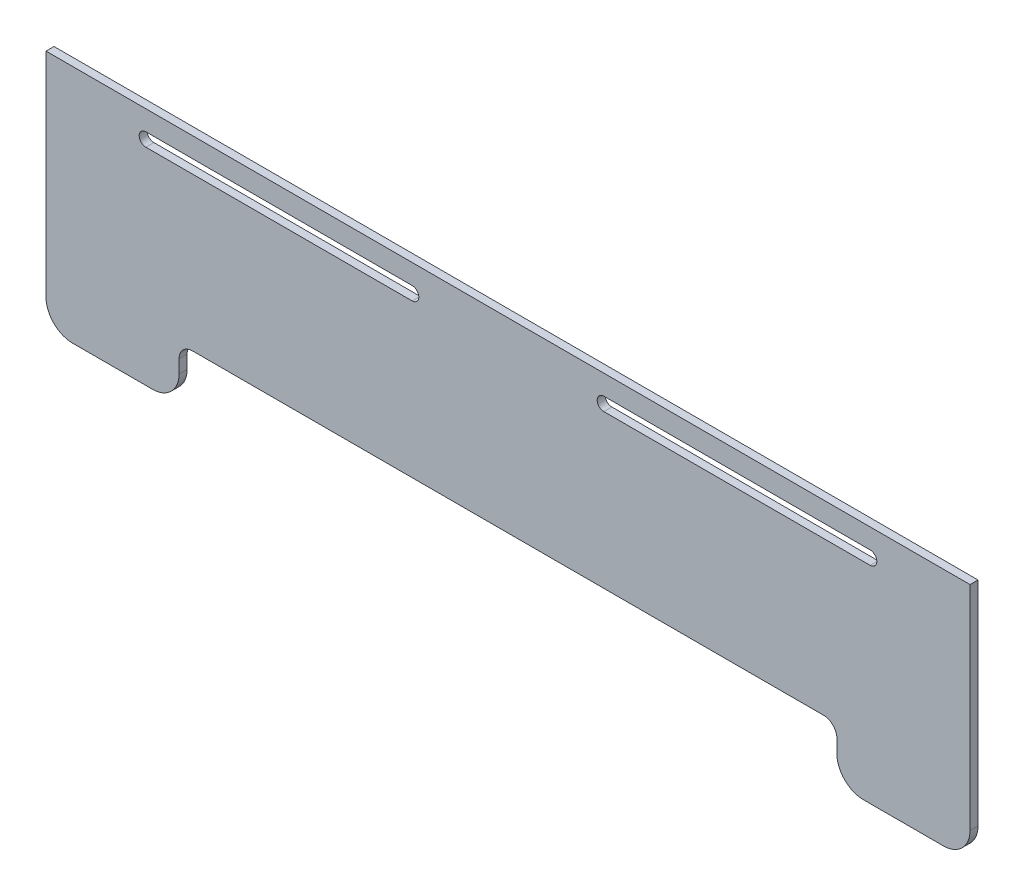
ISO-10303-21;
HEADER;
FILE_DESCRIPTION(('STEP AP214'),'2;1');
FILE_NAME('part.step','',(''),(''),'','','');
FILE_SCHEMA(('AUTOMOTIVE_DESIGN { 1 0 10303 214 1 1 1 1 }'));
ENDSEC;
DATA;
#1=APPLICATION_CONTEXT('core data for automotive mechanical design processes');
#2=APPLICATION_PROTOCOL_DEFINITION('international standard','automotive_design',2000,#1);
#3=PRODUCT_CONTEXT('',#1,'mechanical');
#4=PRODUCT('Part','Part','',(#3));
#5=PRODUCT_RELATED_PRODUCT_CATEGORY('part','',(#4));
#6=PRODUCT_DEFINITION_FORMATION('','',#4);
#7=PRODUCT_DEFINITION_CONTEXT('part definition',#1,'design');
#8=PRODUCT_DEFINITION('design','',#6,#7);
#9=PRODUCT_DEFINITION_SHAPE('','',#8);
#10=(LENGTH_UNIT() NAMED_UNIT(*) SI_UNIT(.MILLI.,.METRE.));
#11=(NAMED_UNIT(*) PLANE_ANGLE_UNIT() SI_UNIT($,.RADIAN.));
#12=(NAMED_UNIT(*) SI_UNIT($,.STERADIAN.) SOLID_ANGLE_UNIT());
#13=UNCERTAINTY_MEASURE_WITH_UNIT(LENGTH_MEASURE(1.E-05),#10,'distance_accuracy_value','');
#14=(GEOMETRIC_REPRESENTATION_CONTEXT(3) GLOBAL_UNCERTAINTY_ASSIGNED_CONTEXT((#13)) GLOBAL_UNIT_ASSIGNED_CONTEXT((#10,
#11,#12)) REPRESENTATION_CONTEXT('',''));
#15=CARTESIAN_POINT('',(0.,0.,0.));
#16=DIRECTION('',(0.,0.,1.));
#17=DIRECTION('',(1.,0.,0.));
#18=AXIS2_PLACEMENT_3D('',#15,#16,#17);
#19=CARTESIAN_POINT('',(-163.5,-80.,3.));
#20=DIRECTION('',(0.,0.,-1.));
#21=DIRECTION('',(-1.,0.,0.));
#22=AXIS2_PLACEMENT_3D('',#19,#20,#21);
#23=PLANE('',#22);
#24=CARTESIAN_POINT('',(36.,-9.99999999999982,3.));
#25=DIRECTION('',(0.,0.,1.));
#26=DIRECTION('',(1.,0.,0.));
#27=AXIS2_PLACEMENT_3D('',#24,#25,#26);
#28=CIRCLE('',#27,2.49999999999995);
#29=CARTESIAN_POINT('',(36.,-7.50000000000008,3.));
#30=VERTEX_POINT('',#29);
#31=CARTESIAN_POINT('',(36.,-12.5,3.));
#32=VERTEX_POINT('',#31);
#33=EDGE_CURVE('E218',#30,#32,#28,.T.);
#34=ORIENTED_EDGE('',*,*,#33,.F.);
#35=DIRECTION('',(-1.,0.,0.));
#36=VECTOR('',#35,1.);
#37=CARTESIAN_POINT('',(36.,-7.50000000000008,3.));
#38=LINE('',#37,#36);
#39=CARTESIAN_POINT('',(136.,-7.50000000000006,3.));
#40=VERTEX_POINT('',#39);
#41=EDGE_CURVE('E226',#40,#30,#38,.T.);
#42=ORIENTED_EDGE('',*,*,#41,.F.);
#43=CARTESIAN_POINT('',(136.,-9.99999999999981,3.));
#44=DIRECTION('',(0.,0.,1.));
#45=DIRECTION('',(1.,0.,0.));
#46=AXIS2_PLACEMENT_3D('',#43,#44,#45);
#47=CIRCLE('',#46,2.49999999999995);
#48=CARTESIAN_POINT('',(136.,-12.4999999999998,3.));
#49=VERTEX_POINT('',#48);
#50=EDGE_CURVE('E223',#49,#40,#47,.T.);
#51=ORIENTED_EDGE('',*,*,#50,.F.);
#52=DIRECTION('',(1.,0.,0.));
#53=VECTOR('',#52,1.);
#54=CARTESIAN_POINT('',(36.,-12.5,3.));
#55=LINE('',#54,#53);
#56=EDGE_CURVE('E220',#32,#49,#55,.T.);
#57=ORIENTED_EDGE('',*,*,#56,.F.);
#58=EDGE_LOOP('',(#34,#42,#51,#57));
#59=FACE_BOUND('',#58,.T.);
#60=DIRECTION('',(0.,-1.,0.));
#61=VECTOR('',#60,1.);
#62=CARTESIAN_POINT('',(-173.5,0.,3.));
#63=LINE('',#62,#61);
#64=CARTESIAN_POINT('',(-173.5,0.,3.));
#65=VERTEX_POINT('',#64);
#66=CARTESIAN_POINT('',(-173.5,-80.,3.));
#67=VERTEX_POINT('',#66);
#68=EDGE_CURVE('E249',#65,#67,#63,.T.);
#69=ORIENTED_EDGE('',*,*,#68,.T.);
#70=CARTESIAN_POINT('',(-163.5,-80.,3.));
#71=DIRECTION('',(0.,0.,1.));
#72=DIRECTION('',(-1.,0.,0.));
#73=AXIS2_PLACEMENT_3D('',#70,#71,#72);
#74=CIRCLE('',#73,9.99999999999999);
#75=CARTESIAN_POINT('',(-163.5,-90.,3.));
#76=VERTEX_POINT('',#75);
#77=EDGE_CURVE('E252',#67,#76,#74,.T.);
#78=ORIENTED_EDGE('',*,*,#77,.T.);
#79=DIRECTION('',(1.,0.,0.));
#80=VECTOR('',#79,1.);
#81=CARTESIAN_POINT('',(-163.5,-90.,3.));
#82=LINE('',#81,#80);
#83=CARTESIAN_POINT('',(-133.5,-90.,3.));
#84=VERTEX_POINT('',#83);
#85=EDGE_CURVE('E255',#76,#84,#82,.T.);
#86=ORIENTED_EDGE('',*,*,#85,.T.);
#87=CARTESIAN_POINT('',(-133.5,-80.,3.));
#88=DIRECTION('',(0.,0.,1.));
#89=DIRECTION('',(1.,0.,0.));
#90=AXIS2_PLACEMENT_3D('',#87,#88,#89);
#91=CIRCLE('',#90,9.99999999999999);
#92=CARTESIAN_POINT('',(-123.5,-80.,3.));
#93=VERTEX_POINT('',#92);
#94=EDGE_CURVE('E257',#84,#93,#91,.T.);
#95=ORIENTED_EDGE('',*,*,#94,.T.);
#96=DIRECTION('',(0.,1.,0.));
#97=VECTOR('',#96,1.);
#98=CARTESIAN_POINT('',(-123.5,-75.,3.));
#99=LINE('',#98,#97);
#100=CARTESIAN_POINT('',(-123.5,-75.,3.));
#101=VERTEX_POINT('',#100);
#102=EDGE_CURVE('E259',#93,#101,#99,.T.);
#103=ORIENTED_EDGE('',*,*,#102,.T.);
#104=CARTESIAN_POINT('',(-118.5,-75.,3.));
#105=DIRECTION('',(0.,0.,-1.));
#106=DIRECTION('',(-1.,0.,0.));
#107=AXIS2_PLACEMENT_3D('',#104,#105,#106);
#108=CIRCLE('',#107,5.);
#109=CARTESIAN_POINT('',(-118.5,-70.,3.));
#110=VERTEX_POINT('',#109);
#111=EDGE_CURVE('E261',#101,#110,#108,.T.);
#112=ORIENTED_EDGE('',*,*,#111,.T.);
#113=DIRECTION('',(1.,0.,0.));
#114=VECTOR('',#113,1.);
#115=CARTESIAN_POINT('',(-118.5,-70.,3.));
#116=LINE('',#115,#114);
#117=CARTESIAN_POINT('',(118.5,-70.,3.));
#118=VERTEX_POINT('',#117);
#119=EDGE_CURVE('E263',#110,#118,#116,.T.);
#120=ORIENTED_EDGE('',*,*,#119,.T.);
#121=CARTESIAN_POINT('',(118.5,-75.,3.));
#122=DIRECTION('',(0.,0.,-1.));
#123=DIRECTION('',(1.,0.,0.));
#124=AXIS2_PLACEMENT_3D('',#121,#122,#123);
#125=CIRCLE('',#124,5.);
#126=CARTESIAN_POINT('',(123.5,-75.,3.));
#127=VERTEX_POINT('',#126);
#128=EDGE_CURVE('E265',#118,#127,#125,.T.);
#129=ORIENTED_EDGE('',*,*,#128,.T.);
#130=DIRECTION('',(0.,-1.,0.));
#131=VECTOR('',#130,1.);
#132=CARTESIAN_POINT('',(123.5,-75.,3.));
#133=LINE('',#132,#131);
#134=CARTESIAN_POINT('',(123.5,-80.,3.));
#135=VERTEX_POINT('',#134);
#136=EDGE_CURVE('E267',#127,#135,#133,.T.);
#137=ORIENTED_EDGE('',*,*,#136,.T.);
#138=CARTESIAN_POINT('',(133.5,-80.,3.));
#139=DIRECTION('',(0.,0.,1.));
#140=DIRECTION('',(-1.,0.,0.));
#141=AXIS2_PLACEMENT_3D('',#138,#139,#140);
#142=CIRCLE('',#141,9.99999999999999);
#143=CARTESIAN_POINT('',(133.5,-90.,3.));
#144=VERTEX_POINT('',#143);
#145=EDGE_CURVE('E269',#135,#144,#142,.T.);
#146=ORIENTED_EDGE('',*,*,#145,.T.);
#147=DIRECTION('',(1.,0.,0.));
#148=VECTOR('',#147,1.);
#149=CARTESIAN_POINT('',(163.5,-90.,3.));
#150=LINE('',#149,#148);
#151=CARTESIAN_POINT('',(163.5,-90.,3.));
#152=VERTEX_POINT('',#151);
#153=EDGE_CURVE('E271',#144,#152,#150,.T.);
#154=ORIENTED_EDGE('',*,*,#153,.T.);
#155=CARTESIAN_POINT('',(163.5,-80.,3.));
#156=DIRECTION('',(0.,0.,1.));
#157=DIRECTION('',(-1.,0.,0.));
#158=AXIS2_PLACEMENT_3D('',#155,#156,#157);
#159=CIRCLE('',#158,9.99999999999999);
#160=CARTESIAN_POINT('',(173.5,-80.,3.));
#161=VERTEX_POINT('',#160);
#162=EDGE_CURVE('E273',#152,#161,#159,.T.);
#163=ORIENTED_EDGE('',*,*,#162,.T.);
#164=DIRECTION('',(0.,1.,0.));
#165=VECTOR('',#164,1.);
#166=CARTESIAN_POINT('',(173.5,0.,3.));
#167=LINE('',#166,#165);
#168=CARTESIAN_POINT('',(173.5,0.,3.));
#169=VERTEX_POINT('',#168);
#170=EDGE_CURVE('E275',#161,#169,#167,.T.);
#171=ORIENTED_EDGE('',*,*,#170,.T.);
#172=DIRECTION('',(-1.,0.,0.));
#173=VECTOR('',#172,1.);
#174=CARTESIAN_POINT('',(-173.5,0.,3.));
#175=LINE('',#174,#173);
#176=EDGE_CURVE('E277',#169,#65,#175,.T.);
#177=ORIENTED_EDGE('',*,*,#176,.T.);
#178=EDGE_LOOP('',(#69,#78,#86,#95,#103,#112,#120,#129,#137,#146,#154,#163,#171,#177));
#179=FACE_BOUND('',#178,.T.);
#180=CARTESIAN_POINT('',(-36.,-10.0000000000001,3.));
#181=DIRECTION('',(0.,0.,1.));
#182=DIRECTION('',(-1.,0.,0.));
#183=AXIS2_PLACEMENT_3D('',#180,#181,#182);
#184=CIRCLE('',#183,2.49999999999995);
#185=CARTESIAN_POINT('',(-36.,-12.5,3.));
#186=VERTEX_POINT('',#185);
#187=CARTESIAN_POINT('',(-36.,-7.50000000000008,3.));
#188=VERTEX_POINT('',#187);
#189=EDGE_CURVE('E182',#186,#188,#184,.T.);
#190=ORIENTED_EDGE('',*,*,#189,.F.);
#191=DIRECTION('',(1.,0.,0.));
#192=VECTOR('',#191,1.);
#193=CARTESIAN_POINT('',(-36.,-12.5,3.));
#194=LINE('',#193,#192);
#195=CARTESIAN_POINT('',(-136.,-12.5,3.));
#196=VERTEX_POINT('',#195);
#197=EDGE_CURVE('E204',#196,#186,#194,.T.);
#198=ORIENTED_EDGE('',*,*,#197,.F.);
#199=CARTESIAN_POINT('',(-136.,-9.99999999999981,3.));
#200=DIRECTION('',(0.,0.,1.));
#201=DIRECTION('',(-1.,0.,0.));
#202=AXIS2_PLACEMENT_3D('',#199,#200,#201);
#203=CIRCLE('',#202,2.49999999999995);
#204=CARTESIAN_POINT('',(-136.,-7.50000000000006,3.));
#205=VERTEX_POINT('',#204);
#206=EDGE_CURVE('E202',#205,#196,#203,.T.);
#207=ORIENTED_EDGE('',*,*,#206,.F.);
#208=DIRECTION('',(-1.,0.,0.));
#209=VECTOR('',#208,1.);
#210=CARTESIAN_POINT('',(-36.,-7.50000000000008,3.));
#211=LINE('',#210,#209);
#212=EDGE_CURVE('E190',#188,#205,#211,.T.);
#213=ORIENTED_EDGE('',*,*,#212,.F.);
#214=EDGE_LOOP('',(#190,#198,#207,#213));
#215=FACE_BOUND('',#214,.T.);
#216=ADVANCED_FACE('F33',(#59,#179,#215),#23,.F.);
#217=CARTESIAN_POINT('',(-163.5,-80.,0.));
#218=DIRECTION('',(0.,0.,-1.));
#219=DIRECTION('',(-1.,0.,0.));
#220=AXIS2_PLACEMENT_3D('',#217,#218,#219);
#221=PLANE('',#220);
#222=DIRECTION('',(0.,-1.,0.));
#223=VECTOR('',#222,1.);
#224=CARTESIAN_POINT('',(-173.5,0.,0.));
#225=LINE('',#224,#223);
#226=CARTESIAN_POINT('',(-173.5,0.,0.));
#227=VERTEX_POINT('',#226);
#228=CARTESIAN_POINT('',(-173.5,-80.,0.));
#229=VERTEX_POINT('',#228);
#230=EDGE_CURVE('E248',#227,#229,#225,.T.);
#231=ORIENTED_EDGE('',*,*,#230,.F.);
#232=DIRECTION('',(-1.,0.,0.));
#233=VECTOR('',#232,1.);
#234=CARTESIAN_POINT('',(-173.5,0.,0.));
#235=LINE('',#234,#233);
#236=CARTESIAN_POINT('',(173.5,0.,0.));
#237=VERTEX_POINT('',#236);
#238=EDGE_CURVE('E253',#237,#227,#235,.T.);
#239=ORIENTED_EDGE('',*,*,#238,.F.);
#240=DIRECTION('',(0.,1.,0.));
#241=VECTOR('',#240,1.);
#242=CARTESIAN_POINT('',(173.5,0.,0.));
#243=LINE('',#242,#241);
#244=CARTESIAN_POINT('',(173.5,-80.,0.));
#245=VERTEX_POINT('',#244);
#246=EDGE_CURVE('E304',#245,#237,#243,.T.);
#247=ORIENTED_EDGE('',*,*,#246,.F.);
#248=CARTESIAN_POINT('',(163.5,-80.,0.));
#249=DIRECTION('',(0.,0.,1.));
#250=DIRECTION('',(-1.,0.,0.));
#251=AXIS2_PLACEMENT_3D('',#248,#249,#250);
#252=CIRCLE('',#251,9.99999999999999);
#253=CARTESIAN_POINT('',(163.5,-90.,0.));
#254=VERTEX_POINT('',#253);
#255=EDGE_CURVE('E302',#254,#245,#252,.T.);
#256=ORIENTED_EDGE('',*,*,#255,.F.);
#257=DIRECTION('',(1.,0.,0.));
#258=VECTOR('',#257,1.);
#259=CARTESIAN_POINT('',(163.5,-90.,0.));
#260=LINE('',#259,#258);
#261=CARTESIAN_POINT('',(133.5,-90.,0.));
#262=VERTEX_POINT('',#261);
#263=EDGE_CURVE('E300',#262,#254,#260,.T.);
#264=ORIENTED_EDGE('',*,*,#263,.F.);
#265=CARTESIAN_POINT('',(133.5,-80.,0.));
#266=DIRECTION('',(0.,0.,1.));
#267=DIRECTION('',(-1.,0.,0.));
#268=AXIS2_PLACEMENT_3D('',#265,#266,#267);
#269=CIRCLE('',#268,9.99999999999999);
#270=CARTESIAN_POINT('',(123.5,-80.,0.));
#271=VERTEX_POINT('',#270);
#272=EDGE_CURVE('E298',#271,#262,#269,.T.);
#273=ORIENTED_EDGE('',*,*,#272,.F.);
#274=DIRECTION('',(0.,-1.,0.));
#275=VECTOR('',#274,1.);
#276=CARTESIAN_POINT('',(123.5,-75.,0.));
#277=LINE('',#276,#275);
#278=CARTESIAN_POINT('',(123.5,-75.,0.));
#279=VERTEX_POINT('',#278);
#280=EDGE_CURVE('E296',#279,#271,#277,.T.);
#281=ORIENTED_EDGE('',*,*,#280,.F.);
#282=CARTESIAN_POINT('',(118.5,-75.,0.));
#283=DIRECTION('',(0.,0.,-1.));
#284=DIRECTION('',(1.,0.,0.));
#285=AXIS2_PLACEMENT_3D('',#282,#283,#284);
#286=CIRCLE('',#285,5.);
#287=CARTESIAN_POINT('',(118.5,-70.,0.));
#288=VERTEX_POINT('',#287);
#289=EDGE_CURVE('E294',#288,#279,#286,.T.);
#290=ORIENTED_EDGE('',*,*,#289,.F.);
#291=DIRECTION('',(1.,0.,0.));
#292=VECTOR('',#291,1.);
#293=CARTESIAN_POINT('',(-118.5,-70.,0.));
#294=LINE('',#293,#292);
#295=CARTESIAN_POINT('',(-118.5,-70.,0.));
#296=VERTEX_POINT('',#295);
#297=EDGE_CURVE('E292',#296,#288,#294,.T.);
#298=ORIENTED_EDGE('',*,*,#297,.F.);
#299=CARTESIAN_POINT('',(-118.5,-75.,0.));
#300=DIRECTION('',(0.,0.,-1.));
#301=DIRECTION('',(-1.,0.,0.));
#302=AXIS2_PLACEMENT_3D('',#299,#300,#301);
#303=CIRCLE('',#302,5.);
#304=CARTESIAN_POINT('',(-123.5,-75.,0.));
#305=VERTEX_POINT('',#304);
#306=EDGE_CURVE('E290',#305,#296,#303,.T.);
#307=ORIENTED_EDGE('',*,*,#306,.F.);
#308=DIRECTION('',(0.,1.,0.));
#309=VECTOR('',#308,1.);
#310=CARTESIAN_POINT('',(-123.5,-75.,0.));
#311=LINE('',#310,#309);
#312=CARTESIAN_POINT('',(-123.5,-80.,0.));
#313=VERTEX_POINT('',#312);
#314=EDGE_CURVE('E288',#313,#305,#311,.T.);
#315=ORIENTED_EDGE('',*,*,#314,.F.);
#316=CARTESIAN_POINT('',(-133.5,-80.,0.));
#317=DIRECTION('',(0.,0.,1.));
#318=DIRECTION('',(1.,0.,0.));
#319=AXIS2_PLACEMENT_3D('',#316,#317,#318);
#320=CIRCLE('',#319,9.99999999999999);
#321=CARTESIAN_POINT('',(-133.5,-90.,0.));
#322=VERTEX_POINT('',#321);
#323=EDGE_CURVE('E286',#322,#313,#320,.T.);
#324=ORIENTED_EDGE('',*,*,#323,.F.);
#325=DIRECTION('',(1.,0.,0.));
#326=VECTOR('',#325,1.);
#327=CARTESIAN_POINT('',(-163.5,-90.,0.));
#328=LINE('',#327,#326);
#329=CARTESIAN_POINT('',(-163.5,-90.,0.));
#330=VERTEX_POINT('',#329);
#331=EDGE_CURVE('E284',#330,#322,#328,.T.);
#332=ORIENTED_EDGE('',*,*,#331,.F.);
#333=CARTESIAN_POINT('',(-163.5,-80.,0.));
#334=DIRECTION('',(0.,0.,1.));
#335=DIRECTION('',(-1.,0.,0.));
#336=AXIS2_PLACEMENT_3D('',#333,#334,#335);
#337=CIRCLE('',#336,9.99999999999999);
#338=EDGE_CURVE('E282',#229,#330,#337,.T.);
#339=ORIENTED_EDGE('',*,*,#338,.F.);
#340=EDGE_LOOP('',(#231,#239,#247,#256,#264,#273,#281,#290,#298,#307,#315,#324,#332,#339));
#341=FACE_BOUND('',#340,.T.);
#342=DIRECTION('',(-1.,0.,0.));
#343=VECTOR('',#342,1.);
#344=CARTESIAN_POINT('',(36.,-7.50000000000008,0.));
#345=LINE('',#344,#343);
#346=CARTESIAN_POINT('',(136.,-7.50000000000006,0.));
#347=VERTEX_POINT('',#346);
#348=CARTESIAN_POINT('',(36.,-7.50000000000008,0.));
#349=VERTEX_POINT('',#348);
#350=EDGE_CURVE('E221',#347,#349,#345,.T.);
#351=ORIENTED_EDGE('',*,*,#350,.T.);
#352=CARTESIAN_POINT('',(36.,-9.99999999999982,0.));
#353=DIRECTION('',(0.,0.,1.));
#354=DIRECTION('',(1.,0.,0.));
#355=AXIS2_PLACEMENT_3D('',#352,#353,#354);
#356=CIRCLE('',#355,2.49999999999995);
#357=CARTESIAN_POINT('',(36.,-12.5,0.));
#358=VERTEX_POINT('',#357);
#359=EDGE_CURVE('E198',#349,#358,#356,.T.);
#360=ORIENTED_EDGE('',*,*,#359,.T.);
#361=DIRECTION('',(1.,0.,0.));
#362=VECTOR('',#361,1.);
#363=CARTESIAN_POINT('',(36.,-12.5,0.));
#364=LINE('',#363,#362);
#365=CARTESIAN_POINT('',(136.,-12.4999999999998,0.));
#366=VERTEX_POINT('',#365);
#367=EDGE_CURVE('E231',#358,#366,#364,.T.);
#368=ORIENTED_EDGE('',*,*,#367,.T.);
#369=CARTESIAN_POINT('',(136.,-9.99999999999981,0.));
#370=DIRECTION('',(0.,0.,1.));
#371=DIRECTION('',(1.,0.,0.));
#372=AXIS2_PLACEMENT_3D('',#369,#370,#371);
#373=CIRCLE('',#372,2.49999999999995);
#374=EDGE_CURVE('E234',#366,#347,#373,.T.);
#375=ORIENTED_EDGE('',*,*,#374,.T.);
#376=EDGE_LOOP('',(#351,#360,#368,#375));
#377=FACE_BOUND('',#376,.T.);
#378=DIRECTION('',(1.,0.,0.));
#379=VECTOR('',#378,1.);
#380=CARTESIAN_POINT('',(-36.,-12.5,0.));
#381=LINE('',#380,#379);
#382=CARTESIAN_POINT('',(-136.,-12.4999999999998,0.));
#383=VERTEX_POINT('',#382);
#384=CARTESIAN_POINT('',(-36.,-12.5,0.));
#385=VERTEX_POINT('',#384);
#386=EDGE_CURVE('E191',#383,#385,#381,.T.);
#387=ORIENTED_EDGE('',*,*,#386,.T.);
#388=CARTESIAN_POINT('',(-36.,-10.0000000000001,0.));
#389=DIRECTION('',(0.,0.,1.));
#390=DIRECTION('',(-1.,0.,0.));
#391=AXIS2_PLACEMENT_3D('',#388,#389,#390);
#392=CIRCLE('',#391,2.49999999999995);
#393=CARTESIAN_POINT('',(-36.,-7.50000000000008,0.));
#394=VERTEX_POINT('',#393);
#395=EDGE_CURVE('E56',#385,#394,#392,.T.);
#396=ORIENTED_EDGE('',*,*,#395,.T.);
#397=DIRECTION('',(-1.,0.,0.));
#398=VECTOR('',#397,1.);
#399=CARTESIAN_POINT('',(-36.,-7.50000000000008,0.));
#400=LINE('',#399,#398);
#401=CARTESIAN_POINT('',(-136.,-7.50000000000006,0.));
#402=VERTEX_POINT('',#401);
#403=EDGE_CURVE('E197',#394,#402,#400,.T.);
#404=ORIENTED_EDGE('',*,*,#403,.T.);
#405=CARTESIAN_POINT('',(-136.,-9.99999999999981,0.));
#406=DIRECTION('',(0.,0.,1.));
#407=DIRECTION('',(-1.,0.,0.));
#408=AXIS2_PLACEMENT_3D('',#405,#406,#407);
#409=CIRCLE('',#408,2.49999999999995);
#410=EDGE_CURVE('E210',#402,#383,#409,.T.);
#411=ORIENTED_EDGE('',*,*,#410,.T.);
#412=EDGE_LOOP('',(#387,#396,#404,#411));
#413=FACE_BOUND('',#412,.T.);
#414=ADVANCED_FACE('F352',(#341,#377,#413),#221,.T.);
#415=CARTESIAN_POINT('',(-173.5,0.,3.));
#416=DIRECTION('',(1.,0.,0.));
#417=DIRECTION('',(0.,0.,-1.));
#418=AXIS2_PLACEMENT_3D('',#415,#416,#417);
#419=PLANE('',#418);
#420=ORIENTED_EDGE('',*,*,#230,.T.);
#421=DIRECTION('',(0.,0.,-1.));
#422=VECTOR('',#421,1.);
#423=CARTESIAN_POINT('',(-173.5,-80.,3.));
#424=LINE('',#423,#422);
#425=EDGE_CURVE('E11',#67,#229,#424,.T.);
#426=ORIENTED_EDGE('',*,*,#425,.F.);
#427=ORIENTED_EDGE('',*,*,#68,.F.);
#428=DIRECTION('',(0.,0.,-1.));
#429=VECTOR('',#428,1.);
#430=CARTESIAN_POINT('',(-173.5,0.,3.));
#431=LINE('',#430,#429);
#432=EDGE_CURVE('E279',#65,#227,#431,.T.);
#433=ORIENTED_EDGE('',*,*,#432,.T.);
#434=EDGE_LOOP('',(#420,#426,#427,#433));
#435=FACE_BOUND('',#434,.T.);
#436=ADVANCED_FACE('F35',(#435),#419,.F.);
#437=CARTESIAN_POINT('',(-163.5,-80.,3.));
#438=DIRECTION('',(0.,0.,-1.));
#439=DIRECTION('',(-1.,0.,0.));
#440=AXIS2_PLACEMENT_3D('',#437,#438,#439);
#441=CYLINDRICAL_SURFACE('',#440,9.99999999999999);
#442=ORIENTED_EDGE('',*,*,#338,.T.);
#443=DIRECTION('',(0.,0.,-1.));
#444=VECTOR('',#443,1.);
#445=CARTESIAN_POINT('',(-163.5,-90.,3.));
#446=LINE('',#445,#444);
#447=EDGE_CURVE('E41',#76,#330,#446,.T.);
#448=ORIENTED_EDGE('',*,*,#447,.F.);
#449=ORIENTED_EDGE('',*,*,#77,.F.);
#450=ORIENTED_EDGE('',*,*,#425,.T.);
#451=EDGE_LOOP('',(#442,#448,#449,#450));
#452=FACE_BOUND('',#451,.T.);
#453=ADVANCED_FACE('F369',(#452),#441,.T.);
#454=CARTESIAN_POINT('',(-163.5,-90.,3.));
#455=DIRECTION('',(0.,1.,0.));
#456=DIRECTION('',(-1.,0.,0.));
#457=AXIS2_PLACEMENT_3D('',#454,#455,#456);
#458=PLANE('',#457);
#459=ORIENTED_EDGE('',*,*,#331,.T.);
#460=DIRECTION('',(0.,0.,-1.));
#461=VECTOR('',#460,1.);
#462=CARTESIAN_POINT('',(-133.5,-90.,3.));
#463=LINE('',#462,#461);
#464=EDGE_CURVE('E339',#84,#322,#463,.T.);
#465=ORIENTED_EDGE('',*,*,#464,.F.);
#466=ORIENTED_EDGE('',*,*,#85,.F.);
#467=ORIENTED_EDGE('',*,*,#447,.T.);
#468=EDGE_LOOP('',(#459,#465,#466,#467));
#469=FACE_BOUND('',#468,.T.);
#470=ADVANCED_FACE('F346',(#469),#458,.F.);
#471=CARTESIAN_POINT('',(-133.5,-80.,3.));
#472=DIRECTION('',(0.,0.,-1.));
#473=DIRECTION('',(-1.,0.,0.));
#474=AXIS2_PLACEMENT_3D('',#471,#472,#473);
#475=CYLINDRICAL_SURFACE('',#474,9.99999999999999);
#476=ORIENTED_EDGE('',*,*,#323,.T.);
#477=DIRECTION('',(0.,0.,-1.));
#478=VECTOR('',#477,1.);
#479=CARTESIAN_POINT('',(-123.5,-80.,3.));
#480=LINE('',#479,#478);
#481=EDGE_CURVE('E336',#93,#313,#480,.T.);
#482=ORIENTED_EDGE('',*,*,#481,.F.);
#483=ORIENTED_EDGE('',*,*,#94,.F.);
#484=ORIENTED_EDGE('',*,*,#464,.T.);
#485=EDGE_LOOP('',(#476,#482,#483,#484));
#486=FACE_BOUND('',#485,.T.);
#487=ADVANCED_FACE('F358',(#486),#475,.T.);
#488=CARTESIAN_POINT('',(-123.5,-75.,3.));
#489=DIRECTION('',(-1.,0.,0.));
#490=DIRECTION('',(0.,-1.,0.));
#491=AXIS2_PLACEMENT_3D('',#488,#489,#490);
#492=PLANE('',#491);
#493=ORIENTED_EDGE('',*,*,#314,.T.);
#494=DIRECTION('',(0.,0.,-1.));
#495=VECTOR('',#494,1.);
#496=CARTESIAN_POINT('',(-123.5,-75.,3.));
#497=LINE('',#496,#495);
#498=EDGE_CURVE('E333',#101,#305,#497,.T.);
#499=ORIENTED_EDGE('',*,*,#498,.F.);
#500=ORIENTED_EDGE('',*,*,#102,.F.);
#501=ORIENTED_EDGE('',*,*,#481,.T.);
#502=EDGE_LOOP('',(#493,#499,#500,#501));
#503=FACE_BOUND('',#502,.T.);
#504=ADVANCED_FACE('F362',(#503),#492,.F.);
#505=CARTESIAN_POINT('',(-118.5,-75.,3.));
#506=DIRECTION('',(0.,0.,-1.));
#507=DIRECTION('',(-1.,0.,0.));
#508=AXIS2_PLACEMENT_3D('',#505,#506,#507);
#509=CYLINDRICAL_SURFACE('',#508,5.);
#510=ORIENTED_EDGE('',*,*,#306,.T.);
#511=DIRECTION('',(0.,0.,-1.));
#512=VECTOR('',#511,1.);
#513=CARTESIAN_POINT('',(-118.5,-70.,3.));
#514=LINE('',#513,#512);
#515=EDGE_CURVE('E330',#110,#296,#514,.T.);
#516=ORIENTED_EDGE('',*,*,#515,.F.);
#517=ORIENTED_EDGE('',*,*,#111,.F.);
#518=ORIENTED_EDGE('',*,*,#498,.T.);
#519=EDGE_LOOP('',(#510,#516,#517,#518));
#520=FACE_BOUND('',#519,.T.);
#521=ADVANCED_FACE('F412',(#520),#509,.F.);
#522=CARTESIAN_POINT('',(-118.5,-70.,3.));
#523=DIRECTION('',(0.,1.,0.));
#524=DIRECTION('',(0.,0.,1.));
#525=AXIS2_PLACEMENT_3D('',#522,#523,#524);
#526=PLANE('',#525);
#527=ORIENTED_EDGE('',*,*,#297,.T.);
#528=DIRECTION('',(0.,0.,-1.));
#529=VECTOR('',#528,1.);
#530=CARTESIAN_POINT('',(118.5,-70.,3.));
#531=LINE('',#530,#529);
#532=EDGE_CURVE('E327',#118,#288,#531,.T.);
#533=ORIENTED_EDGE('',*,*,#532,.F.);
#534=ORIENTED_EDGE('',*,*,#119,.F.);
#535=ORIENTED_EDGE('',*,*,#515,.T.);
#536=EDGE_LOOP('',(#527,#533,#534,#535));
#537=FACE_BOUND('',#536,.T.);
#538=ADVANCED_FACE('F410',(#537),#526,.F.);
#539=CARTESIAN_POINT('',(118.5,-75.,3.));
#540=DIRECTION('',(0.,0.,-1.));
#541=DIRECTION('',(-1.,0.,0.));
#542=AXIS2_PLACEMENT_3D('',#539,#540,#541);
#543=CYLINDRICAL_SURFACE('',#542,5.);
#544=ORIENTED_EDGE('',*,*,#289,.T.);
#545=DIRECTION('',(0.,0.,-1.));
#546=VECTOR('',#545,1.);
#547=CARTESIAN_POINT('',(123.5,-75.,3.));
#548=LINE('',#547,#546);
#549=EDGE_CURVE('E324',#127,#279,#548,.T.);
#550=ORIENTED_EDGE('',*,*,#549,.F.);
#551=ORIENTED_EDGE('',*,*,#128,.F.);
#552=ORIENTED_EDGE('',*,*,#532,.T.);
#553=EDGE_LOOP('',(#544,#550,#551,#552));
#554=FACE_BOUND('',#553,.T.);
#555=ADVANCED_FACE('F405',(#554),#543,.F.);
#556=CARTESIAN_POINT('',(123.5,-75.,3.));
#557=DIRECTION('',(1.,0.,0.));
#558=DIRECTION('',(0.,1.,0.));
#559=AXIS2_PLACEMENT_3D('',#556,#557,#558);
#560=PLANE('',#559);
#561=ORIENTED_EDGE('',*,*,#280,.T.);
#562=DIRECTION('',(0.,0.,-1.));
#563=VECTOR('',#562,1.);
#564=CARTESIAN_POINT('',(123.5,-80.,3.));
#565=LINE('',#564,#563);
#566=EDGE_CURVE('E321',#135,#271,#565,.T.);
#567=ORIENTED_EDGE('',*,*,#566,.F.);
#568=ORIENTED_EDGE('',*,*,#136,.F.);
#569=ORIENTED_EDGE('',*,*,#549,.T.);
#570=EDGE_LOOP('',(#561,#567,#568,#569));
#571=FACE_BOUND('',#570,.T.);
#572=ADVANCED_FACE('F400',(#571),#560,.F.);
#573=CARTESIAN_POINT('',(133.5,-80.,3.));
#574=DIRECTION('',(0.,0.,-1.));
#575=DIRECTION('',(-1.,0.,0.));
#576=AXIS2_PLACEMENT_3D('',#573,#574,#575);
#577=CYLINDRICAL_SURFACE('',#576,9.99999999999999);
#578=ORIENTED_EDGE('',*,*,#272,.T.);
#579=DIRECTION('',(0.,0.,-1.));
#580=VECTOR('',#579,1.);
#581=CARTESIAN_POINT('',(133.5,-90.,3.));
#582=LINE('',#581,#580);
#583=EDGE_CURVE('E318',#144,#262,#582,.T.);
#584=ORIENTED_EDGE('',*,*,#583,.F.);
#585=ORIENTED_EDGE('',*,*,#145,.F.);
#586=ORIENTED_EDGE('',*,*,#566,.T.);
#587=EDGE_LOOP('',(#578,#584,#585,#586));
#588=FACE_BOUND('',#587,.T.);
#589=ADVANCED_FACE('F396',(#588),#577,.T.);
#590=CARTESIAN_POINT('',(163.5,-90.,3.));
#591=DIRECTION('',(0.,1.,0.));
#592=DIRECTION('',(0.,0.,1.));
#593=AXIS2_PLACEMENT_3D('',#590,#591,#592);
#594=PLANE('',#593);
#595=ORIENTED_EDGE('',*,*,#263,.T.);
#596=DIRECTION('',(0.,0.,-1.));
#597=VECTOR('',#596,1.);
#598=CARTESIAN_POINT('',(163.5,-90.,3.));
#599=LINE('',#598,#597);
#600=EDGE_CURVE('E315',#152,#254,#599,.T.);
#601=ORIENTED_EDGE('',*,*,#600,.F.);
#602=ORIENTED_EDGE('',*,*,#153,.F.);
#603=ORIENTED_EDGE('',*,*,#583,.T.);
#604=EDGE_LOOP('',(#595,#601,#602,#603));
#605=FACE_BOUND('',#604,.T.);
#606=ADVANCED_FACE('F391',(#605),#594,.F.);
#607=CARTESIAN_POINT('',(163.5,-80.,3.));
#608=DIRECTION('',(0.,0.,-1.));
#609=DIRECTION('',(-1.,0.,0.));
#610=AXIS2_PLACEMENT_3D('',#607,#608,#609);
#611=CYLINDRICAL_SURFACE('',#610,9.99999999999999);
#612=ORIENTED_EDGE('',*,*,#255,.T.);
#613=DIRECTION('',(0.,0.,-1.));
#614=VECTOR('',#613,1.);
#615=CARTESIAN_POINT('',(173.5,-80.,3.));
#616=LINE('',#615,#614);
#617=EDGE_CURVE('E312',#161,#245,#616,.T.);
#618=ORIENTED_EDGE('',*,*,#617,.F.);
#619=ORIENTED_EDGE('',*,*,#162,.F.);
#620=ORIENTED_EDGE('',*,*,#600,.T.);
#621=EDGE_LOOP('',(#612,#618,#619,#620));
#622=FACE_BOUND('',#621,.T.);
#623=ADVANCED_FACE('F385',(#622),#611,.T.);
#624=CARTESIAN_POINT('',(173.5,0.,3.));
#625=DIRECTION('',(-1.,0.,0.));
#626=DIRECTION('',(0.,-1.,0.));
#627=AXIS2_PLACEMENT_3D('',#624,#625,#626);
#628=PLANE('',#627);
#629=ORIENTED_EDGE('',*,*,#246,.T.);
#630=DIRECTION('',(0.,0.,-1.));
#631=VECTOR('',#630,1.);
#632=CARTESIAN_POINT('',(173.5,0.,3.));
#633=LINE('',#632,#631);
#634=EDGE_CURVE('E309',#169,#237,#633,.T.);
#635=ORIENTED_EDGE('',*,*,#634,.F.);
#636=ORIENTED_EDGE('',*,*,#170,.F.);
#637=ORIENTED_EDGE('',*,*,#617,.T.);
#638=EDGE_LOOP('',(#629,#635,#636,#637));
#639=FACE_BOUND('',#638,.T.);
#640=ADVANCED_FACE('F381',(#639),#628,.F.);
#641=CARTESIAN_POINT('',(-173.5,0.,3.));
#642=DIRECTION('',(0.,-1.,0.));
#643=DIRECTION('',(1.,0.,0.));
#644=AXIS2_PLACEMENT_3D('',#641,#642,#643);
#645=PLANE('',#644);
#646=ORIENTED_EDGE('',*,*,#238,.T.);
#647=ORIENTED_EDGE('',*,*,#432,.F.);
#648=ORIENTED_EDGE('',*,*,#176,.F.);
#649=ORIENTED_EDGE('',*,*,#634,.T.);
#650=EDGE_LOOP('',(#646,#647,#648,#649));
#651=FACE_BOUND('',#650,.T.);
#652=ADVANCED_FACE('F376',(#651),#645,.F.);
#653=CARTESIAN_POINT('',(36.,-9.99999999999982,3.));
#654=DIRECTION('',(0.,0.,-1.));
#655=DIRECTION('',(-1.,0.,0.));
#656=AXIS2_PLACEMENT_3D('',#653,#654,#655);
#657=CYLINDRICAL_SURFACE('',#656,2.49999999999995);
#658=ORIENTED_EDGE('',*,*,#359,.F.);
#659=DIRECTION('',(0.,0.,-1.));
#660=VECTOR('',#659,1.);
#661=CARTESIAN_POINT('',(36.,-7.50000000000008,3.));
#662=LINE('',#661,#660);
#663=EDGE_CURVE('E228',#30,#349,#662,.T.);
#664=ORIENTED_EDGE('',*,*,#663,.F.);
#665=ORIENTED_EDGE('',*,*,#33,.T.);
#666=DIRECTION('',(0.,0.,-1.));
#667=VECTOR('',#666,1.);
#668=CARTESIAN_POINT('',(36.,-12.5,3.));
#669=LINE('',#668,#667);
#670=EDGE_CURVE('E245',#32,#358,#669,.T.);
#671=ORIENTED_EDGE('',*,*,#670,.T.);
#672=EDGE_LOOP('',(#658,#664,#665,#671));
#673=FACE_BOUND('',#672,.T.);
#674=ADVANCED_FACE('F430',(#673),#657,.F.);
#675=CARTESIAN_POINT('',(36.,-12.5,3.));
#676=DIRECTION('',(0.,1.,0.));
#677=DIRECTION('',(-1.,0.,0.));
#678=AXIS2_PLACEMENT_3D('',#675,#676,#677);
#679=PLANE('',#678);
#680=ORIENTED_EDGE('',*,*,#367,.F.);
#681=ORIENTED_EDGE('',*,*,#670,.F.);
#682=ORIENTED_EDGE('',*,*,#56,.T.);
#683=DIRECTION('',(0.,0.,-1.));
#684=VECTOR('',#683,1.);
#685=CARTESIAN_POINT('',(136.,-12.4999999999998,3.));
#686=LINE('',#685,#684);
#687=EDGE_CURVE('E243',#49,#366,#686,.T.);
#688=ORIENTED_EDGE('',*,*,#687,.T.);
#689=EDGE_LOOP('',(#680,#681,#682,#688));
#690=FACE_BOUND('',#689,.T.);
#691=ADVANCED_FACE('F480',(#690),#679,.T.);
#692=CARTESIAN_POINT('',(136.,-9.99999999999981,3.));
#693=DIRECTION('',(0.,0.,-1.));
#694=DIRECTION('',(-1.,0.,0.));
#695=AXIS2_PLACEMENT_3D('',#692,#693,#694);
#696=CYLINDRICAL_SURFACE('',#695,2.49999999999995);
#697=ORIENTED_EDGE('',*,*,#374,.F.);
#698=ORIENTED_EDGE('',*,*,#687,.F.);
#699=ORIENTED_EDGE('',*,*,#50,.T.);
#700=DIRECTION('',(0.,0.,-1.));
#701=VECTOR('',#700,1.);
#702=CARTESIAN_POINT('',(136.,-7.50000000000006,3.));
#703=LINE('',#702,#701);
#704=EDGE_CURVE('E241',#40,#347,#703,.T.);
#705=ORIENTED_EDGE('',*,*,#704,.T.);
#706=EDGE_LOOP('',(#697,#698,#699,#705));
#707=FACE_BOUND('',#706,.T.);
#708=ADVANCED_FACE('F487',(#707),#696,.F.);
#709=CARTESIAN_POINT('',(36.,-7.50000000000008,3.));
#710=DIRECTION('',(0.,-1.,0.));
#711=DIRECTION('',(1.,0.,0.));
#712=AXIS2_PLACEMENT_3D('',#709,#710,#711);
#713=PLANE('',#712);
#714=ORIENTED_EDGE('',*,*,#350,.F.);
#715=ORIENTED_EDGE('',*,*,#704,.F.);
#716=ORIENTED_EDGE('',*,*,#41,.T.);
#717=ORIENTED_EDGE('',*,*,#663,.T.);
#718=EDGE_LOOP('',(#714,#715,#716,#717));
#719=FACE_BOUND('',#718,.T.);
#720=ADVANCED_FACE('F494',(#719),#713,.T.);
#721=CARTESIAN_POINT('',(-36.,-10.0000000000001,3.));
#722=DIRECTION('',(0.,0.,-1.));
#723=DIRECTION('',(-1.,0.,0.));
#724=AXIS2_PLACEMENT_3D('',#721,#722,#723);
#725=CYLINDRICAL_SURFACE('',#724,2.49999999999995);
#726=ORIENTED_EDGE('',*,*,#395,.F.);
#727=DIRECTION('',(0.,0.,-1.));
#728=VECTOR('',#727,1.);
#729=CARTESIAN_POINT('',(-36.,-12.5,3.));
#730=LINE('',#729,#728);
#731=EDGE_CURVE('E186',#186,#385,#730,.T.);
#732=ORIENTED_EDGE('',*,*,#731,.F.);
#733=ORIENTED_EDGE('',*,*,#189,.T.);
#734=DIRECTION('',(0.,0.,-1.));
#735=VECTOR('',#734,1.);
#736=CARTESIAN_POINT('',(-36.,-7.50000000000008,3.));
#737=LINE('',#736,#735);
#738=EDGE_CURVE('E185',#188,#394,#737,.T.);
#739=ORIENTED_EDGE('',*,*,#738,.T.);
#740=EDGE_LOOP('',(#726,#732,#733,#739));
#741=FACE_BOUND('',#740,.T.);
#742=ADVANCED_FACE('F184',(#741),#725,.F.);
#743=CARTESIAN_POINT('',(-36.,-7.50000000000008,3.));
#744=DIRECTION('',(0.,-1.,0.));
#745=DIRECTION('',(1.,0.,0.));
#746=AXIS2_PLACEMENT_3D('',#743,#744,#745);
#747=PLANE('',#746);
#748=ORIENTED_EDGE('',*,*,#403,.F.);
#749=ORIENTED_EDGE('',*,*,#738,.F.);
#750=ORIENTED_EDGE('',*,*,#212,.T.);
#751=DIRECTION('',(0.,0.,-1.));
#752=VECTOR('',#751,1.);
#753=CARTESIAN_POINT('',(-136.,-7.50000000000006,3.));
#754=LINE('',#753,#752);
#755=EDGE_CURVE('E199',#205,#402,#754,.T.);
#756=ORIENTED_EDGE('',*,*,#755,.T.);
#757=EDGE_LOOP('',(#748,#749,#750,#756));
#758=FACE_BOUND('',#757,.T.);
#759=ADVANCED_FACE('F194',(#758),#747,.T.);
#760=CARTESIAN_POINT('',(-136.,-9.99999999999981,3.));
#761=DIRECTION('',(0.,0.,-1.));
#762=DIRECTION('',(-1.,0.,0.));
#763=AXIS2_PLACEMENT_3D('',#760,#761,#762);
#764=CYLINDRICAL_SURFACE('',#763,2.49999999999995);
#765=ORIENTED_EDGE('',*,*,#410,.F.);
#766=ORIENTED_EDGE('',*,*,#755,.F.);
#767=ORIENTED_EDGE('',*,*,#206,.T.);
#768=DIRECTION('',(0.,0.,-1.));
#769=VECTOR('',#768,1.);
#770=CARTESIAN_POINT('',(-136.,-12.4999999999998,3.));
#771=LINE('',#770,#769);
#772=EDGE_CURVE('E48',#196,#383,#771,.T.);
#773=ORIENTED_EDGE('',*,*,#772,.T.);
#774=EDGE_LOOP('',(#765,#766,#767,#773));
#775=FACE_BOUND('',#774,.T.);
#776=ADVANCED_FACE('F515',(#775),#764,.F.);
#777=CARTESIAN_POINT('',(-36.,-12.5,3.));
#778=DIRECTION('',(0.,1.,0.));
#779=DIRECTION('',(-1.,0.,0.));
#780=AXIS2_PLACEMENT_3D('',#777,#778,#779);
#781=PLANE('',#780);
#782=ORIENTED_EDGE('',*,*,#386,.F.);
#783=ORIENTED_EDGE('',*,*,#772,.F.);
#784=ORIENTED_EDGE('',*,*,#197,.T.);
#785=ORIENTED_EDGE('',*,*,#731,.T.);
#786=EDGE_LOOP('',(#782,#783,#784,#785));
#787=FACE_BOUND('',#786,.T.);
#788=ADVANCED_FACE('F522',(#787),#781,.T.);
#789=CLOSED_SHELL('',(#216,#414,#436,#453,#470,#487,#504,#521,#538,#555,#572,#589,#606,#623,
#640,#652,#674,#691,#708,#720,#742,#759,#776,#788));
#790=MANIFOLD_SOLID_BREP('B2',#789);
#791=ADVANCED_BREP_SHAPE_REPRESENTATION('',(#18,#790),#14);
#792=SHAPE_DEFINITION_REPRESENTATION(#9,#791);
ENDSEC;
END-ISO-10303-21;
